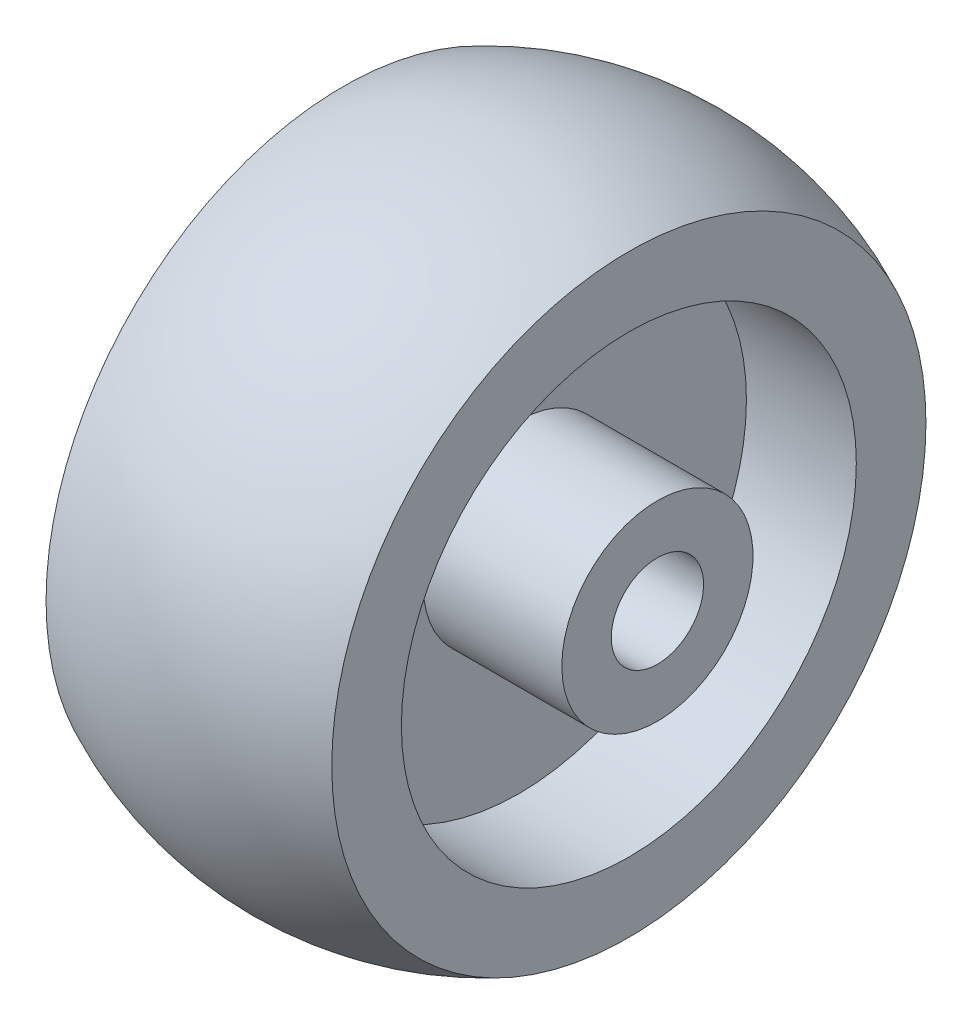
ISO-10303-21;
HEADER;
FILE_DESCRIPTION(('STEP AP214'),'2;1');
FILE_NAME('part.step','',(''),(''),'','','');
FILE_SCHEMA(('AUTOMOTIVE_DESIGN { 1 0 10303 214 1 1 1 1 }'));
ENDSEC;
DATA;
#1=APPLICATION_CONTEXT('core data for automotive mechanical design processes');
#2=APPLICATION_PROTOCOL_DEFINITION('international standard','automotive_design',2000,#1);
#3=PRODUCT_CONTEXT('',#1,'mechanical');
#4=PRODUCT('Part','Part','',(#3));
#5=PRODUCT_RELATED_PRODUCT_CATEGORY('part','',(#4));
#6=PRODUCT_DEFINITION_FORMATION('','',#4);
#7=PRODUCT_DEFINITION_CONTEXT('part definition',#1,'design');
#8=PRODUCT_DEFINITION('design','',#6,#7);
#9=PRODUCT_DEFINITION_SHAPE('','',#8);
#10=(LENGTH_UNIT() NAMED_UNIT(*) SI_UNIT(.MILLI.,.METRE.));
#11=(NAMED_UNIT(*) PLANE_ANGLE_UNIT() SI_UNIT($,.RADIAN.));
#12=(NAMED_UNIT(*) SI_UNIT($,.STERADIAN.) SOLID_ANGLE_UNIT());
#13=UNCERTAINTY_MEASURE_WITH_UNIT(LENGTH_MEASURE(1.E-05),#10,'distance_accuracy_value','');
#14=(GEOMETRIC_REPRESENTATION_CONTEXT(3) GLOBAL_UNCERTAINTY_ASSIGNED_CONTEXT((#13)) GLOBAL_UNIT_ASSIGNED_CONTEXT((#10,
#11,#12)) REPRESENTATION_CONTEXT('',''));
#15=CARTESIAN_POINT('',(0.,0.,0.));
#16=DIRECTION('',(0.,0.,1.));
#17=DIRECTION('',(1.,0.,0.));
#18=AXIS2_PLACEMENT_3D('',#15,#16,#17);
#19=CARTESIAN_POINT('',(6.5,0.,0.));
#20=DIRECTION('',(1.,0.,0.));
#21=DIRECTION('',(0.,1.,0.));
#22=AXIS2_PLACEMENT_3D('',#19,#20,#21);
#23=PLANE('',#22);
#24=CARTESIAN_POINT('',(6.5,0.,0.));
#25=DIRECTION('',(1.,0.,0.));
#26=DIRECTION('',(0.,0.,1.));
#27=AXIS2_PLACEMENT_3D('',#24,#25,#26);
#28=CIRCLE('',#27,10.35);
#29=CARTESIAN_POINT('',(6.5,0.,10.35));
#30=VERTEX_POINT('',#29);
#31=EDGE_CURVE('E61',#30,#30,#28,.T.);
#32=ORIENTED_EDGE('',*,*,#31,.F.);
#33=EDGE_LOOP('',(#32));
#34=FACE_BOUND('',#33,.T.);
#35=CARTESIAN_POINT('',(6.5,0.,0.));
#36=DIRECTION('',(1.,0.,0.));
#37=DIRECTION('',(0.,0.,1.));
#38=AXIS2_PLACEMENT_3D('',#35,#36,#37);
#39=CIRCLE('',#38,13.518505834596);
#40=CARTESIAN_POINT('',(6.5,0.,13.518505834596));
#41=VERTEX_POINT('',#40);
#42=EDGE_CURVE('E128',#41,#41,#39,.T.);
#43=ORIENTED_EDGE('',*,*,#42,.T.);
#44=EDGE_LOOP('',(#43));
#45=FACE_BOUND('',#44,.T.);
#46=ADVANCED_FACE('F51',(#34,#45),#23,.T.);
#47=CARTESIAN_POINT('',(6.5,0.,0.));
#48=DIRECTION('',(-1.,0.,0.));
#49=DIRECTION('',(0.,0.,1.));
#50=AXIS2_PLACEMENT_3D('',#47,#48,#49);
#51=CYLINDRICAL_SURFACE('',#50,10.35);
#52=ORIENTED_EDGE('',*,*,#31,.T.);
#53=DIRECTION('',(-1.,0.,0.));
#54=VECTOR('',#53,1.);
#55=CARTESIAN_POINT('',(6.5,0.,10.35));
#56=LINE('',#55,#54);
#57=CARTESIAN_POINT('',(1.5,0.,10.35));
#58=VERTEX_POINT('',#57);
#59=EDGE_CURVE('E11',#30,#58,#56,.T.);
#60=ORIENTED_EDGE('',*,*,#59,.T.);
#61=CARTESIAN_POINT('',(1.5,0.,0.));
#62=DIRECTION('',(1.,0.,0.));
#63=DIRECTION('',(0.,0.,1.));
#64=AXIS2_PLACEMENT_3D('',#61,#62,#63);
#65=CIRCLE('',#64,10.35);
#66=EDGE_CURVE('E157',#58,#58,#65,.T.);
#67=ORIENTED_EDGE('',*,*,#66,.F.);
#68=ORIENTED_EDGE('',*,*,#59,.F.);
#69=EDGE_LOOP('',(#52,#60,#67,#68));
#70=FACE_BOUND('',#69,.T.);
#71=ADVANCED_FACE('F53',(#70),#51,.F.);
#72=CARTESIAN_POINT('',(1.5,0.,0.));
#73=DIRECTION('',(1.,0.,0.));
#74=DIRECTION('',(0.,1.,0.));
#75=AXIS2_PLACEMENT_3D('',#72,#73,#74);
#76=PLANE('',#75);
#77=CARTESIAN_POINT('',(1.5,0.,0.));
#78=DIRECTION('',(1.,0.,0.));
#79=DIRECTION('',(0.,0.,1.));
#80=AXIS2_PLACEMENT_3D('',#77,#78,#79);
#81=CIRCLE('',#80,4.35);
#82=CARTESIAN_POINT('',(1.5,0.,4.35));
#83=VERTEX_POINT('',#82);
#84=EDGE_CURVE('E171',#83,#83,#81,.T.);
#85=ORIENTED_EDGE('',*,*,#84,.F.);
#86=EDGE_LOOP('',(#85));
#87=FACE_BOUND('',#86,.T.);
#88=ORIENTED_EDGE('',*,*,#66,.T.);
#89=EDGE_LOOP('',(#88));
#90=FACE_BOUND('',#89,.T.);
#91=ADVANCED_FACE('F185',(#87,#90),#76,.T.);
#92=CARTESIAN_POINT('',(1.5,0.,0.));
#93=DIRECTION('',(1.,0.,0.));
#94=DIRECTION('',(0.,0.,1.));
#95=AXIS2_PLACEMENT_3D('',#92,#93,#94);
#96=CYLINDRICAL_SURFACE('',#95,4.35);
#97=ORIENTED_EDGE('',*,*,#84,.T.);
#98=DIRECTION('',(1.,0.,0.));
#99=VECTOR('',#98,1.);
#100=CARTESIAN_POINT('',(1.5,0.,4.35));
#101=LINE('',#100,#99);
#102=CARTESIAN_POINT('',(7.8,0.,4.35));
#103=VERTEX_POINT('',#102);
#104=EDGE_CURVE('E83',#83,#103,#101,.T.);
#105=ORIENTED_EDGE('',*,*,#104,.T.);
#106=CARTESIAN_POINT('',(7.8,0.,0.));
#107=DIRECTION('',(1.,0.,0.));
#108=DIRECTION('',(0.,0.,1.));
#109=AXIS2_PLACEMENT_3D('',#106,#107,#108);
#110=CIRCLE('',#109,4.35);
#111=EDGE_CURVE('E168',#103,#103,#110,.T.);
#112=ORIENTED_EDGE('',*,*,#111,.F.);
#113=ORIENTED_EDGE('',*,*,#104,.F.);
#114=EDGE_LOOP('',(#97,#105,#112,#113));
#115=FACE_BOUND('',#114,.T.);
#116=ADVANCED_FACE('F210',(#115),#96,.T.);
#117=CARTESIAN_POINT('',(7.8,0.,0.));
#118=DIRECTION('',(1.,0.,0.));
#119=DIRECTION('',(0.,1.,0.));
#120=AXIS2_PLACEMENT_3D('',#117,#118,#119);
#121=PLANE('',#120);
#122=CARTESIAN_POINT('',(7.8,0.,0.));
#123=DIRECTION('',(1.,0.,0.));
#124=DIRECTION('',(0.,0.,1.));
#125=AXIS2_PLACEMENT_3D('',#122,#123,#124);
#126=CIRCLE('',#125,2.1);
#127=CARTESIAN_POINT('',(7.8,0.,2.1));
#128=VERTEX_POINT('',#127);
#129=EDGE_CURVE('E95',#128,#128,#126,.T.);
#130=ORIENTED_EDGE('',*,*,#129,.F.);
#131=EDGE_LOOP('',(#130));
#132=FACE_BOUND('',#131,.T.);
#133=ORIENTED_EDGE('',*,*,#111,.T.);
#134=EDGE_LOOP('',(#133));
#135=FACE_BOUND('',#134,.T.);
#136=ADVANCED_FACE('F213',(#132,#135),#121,.T.);
#137=CARTESIAN_POINT('',(-7.8,0.,0.));
#138=DIRECTION('',(1.,0.,0.));
#139=DIRECTION('',(0.,0.,1.));
#140=AXIS2_PLACEMENT_3D('',#137,#138,#139);
#141=CYLINDRICAL_SURFACE('',#140,2.1);
#142=DIRECTION('',(1.,0.,0.));
#143=VECTOR('',#142,1.);
#144=CARTESIAN_POINT('',(-7.8,0.,2.1));
#145=LINE('',#144,#143);
#146=CARTESIAN_POINT('',(-7.8,0.,2.1));
#147=VERTEX_POINT('',#146);
#148=EDGE_CURVE('E100',#147,#128,#145,.T.);
#149=ORIENTED_EDGE('',*,*,#148,.T.);
#150=ORIENTED_EDGE('',*,*,#129,.T.);
#151=ORIENTED_EDGE('',*,*,#148,.F.);
#152=CARTESIAN_POINT('',(-7.8,0.,0.));
#153=DIRECTION('',(1.,0.,0.));
#154=DIRECTION('',(0.,0.,1.));
#155=AXIS2_PLACEMENT_3D('',#152,#153,#154);
#156=CIRCLE('',#155,2.1);
#157=EDGE_CURVE('E163',#147,#147,#156,.T.);
#158=ORIENTED_EDGE('',*,*,#157,.F.);
#159=EDGE_LOOP('',(#149,#150,#151,#158));
#160=FACE_BOUND('',#159,.T.);
#161=ADVANCED_FACE('F208',(#160),#141,.F.);
#162=CARTESIAN_POINT('',(-7.8,0.,0.));
#163=DIRECTION('',(1.,0.,0.));
#164=DIRECTION('',(0.,1.,0.));
#165=AXIS2_PLACEMENT_3D('',#162,#163,#164);
#166=PLANE('',#165);
#167=CARTESIAN_POINT('',(-7.8,0.,0.));
#168=DIRECTION('',(1.,0.,0.));
#169=DIRECTION('',(0.,0.,1.));
#170=AXIS2_PLACEMENT_3D('',#167,#168,#169);
#171=CIRCLE('',#170,4.35);
#172=CARTESIAN_POINT('',(-7.8,0.,4.35));
#173=VERTEX_POINT('',#172);
#174=EDGE_CURVE('E148',#173,#173,#171,.T.);
#175=ORIENTED_EDGE('',*,*,#174,.F.);
#176=EDGE_LOOP('',(#175));
#177=FACE_BOUND('',#176,.T.);
#178=ORIENTED_EDGE('',*,*,#157,.T.);
#179=EDGE_LOOP('',(#178));
#180=FACE_BOUND('',#179,.T.);
#181=ADVANCED_FACE('F204',(#177,#180),#166,.F.);
#182=CARTESIAN_POINT('',(-7.8,0.,0.));
#183=DIRECTION('',(1.,0.,0.));
#184=DIRECTION('',(0.,0.,1.));
#185=AXIS2_PLACEMENT_3D('',#182,#183,#184);
#186=CYLINDRICAL_SURFACE('',#185,4.35);
#187=ORIENTED_EDGE('',*,*,#174,.T.);
#188=DIRECTION('',(1.,0.,0.));
#189=VECTOR('',#188,1.);
#190=CARTESIAN_POINT('',(-7.8,0.,4.35));
#191=LINE('',#190,#189);
#192=CARTESIAN_POINT('',(-1.5,0.,4.35));
#193=VERTEX_POINT('',#192);
#194=EDGE_CURVE('E152',#173,#193,#191,.T.);
#195=ORIENTED_EDGE('',*,*,#194,.T.);
#196=CARTESIAN_POINT('',(-1.5,0.,0.));
#197=DIRECTION('',(1.,0.,0.));
#198=DIRECTION('',(0.,0.,1.));
#199=AXIS2_PLACEMENT_3D('',#196,#197,#198);
#200=CIRCLE('',#199,4.35);
#201=EDGE_CURVE('E153',#193,#193,#200,.T.);
#202=ORIENTED_EDGE('',*,*,#201,.F.);
#203=ORIENTED_EDGE('',*,*,#194,.F.);
#204=EDGE_LOOP('',(#187,#195,#202,#203));
#205=FACE_BOUND('',#204,.T.);
#206=ADVANCED_FACE('F200',(#205),#186,.T.);
#207=CARTESIAN_POINT('',(-1.5,0.,0.));
#208=DIRECTION('',(1.,0.,0.));
#209=DIRECTION('',(0.,1.,0.));
#210=AXIS2_PLACEMENT_3D('',#207,#208,#209);
#211=PLANE('',#210);
#212=CARTESIAN_POINT('',(-1.5,0.,0.));
#213=DIRECTION('',(1.,0.,0.));
#214=DIRECTION('',(0.,0.,1.));
#215=AXIS2_PLACEMENT_3D('',#212,#213,#214);
#216=CIRCLE('',#215,10.35);
#217=CARTESIAN_POINT('',(-1.5,0.,10.35));
#218=VERTEX_POINT('',#217);
#219=EDGE_CURVE('E140',#218,#218,#216,.T.);
#220=ORIENTED_EDGE('',*,*,#219,.F.);
#221=EDGE_LOOP('',(#220));
#222=FACE_BOUND('',#221,.T.);
#223=ORIENTED_EDGE('',*,*,#201,.T.);
#224=EDGE_LOOP('',(#223));
#225=FACE_BOUND('',#224,.T.);
#226=ADVANCED_FACE('F193',(#222,#225),#211,.F.);
#227=CARTESIAN_POINT('',(-1.5,0.,0.));
#228=DIRECTION('',(-1.,0.,0.));
#229=DIRECTION('',(0.,0.,1.));
#230=AXIS2_PLACEMENT_3D('',#227,#228,#229);
#231=CYLINDRICAL_SURFACE('',#230,10.35);
#232=ORIENTED_EDGE('',*,*,#219,.T.);
#233=DIRECTION('',(-1.,0.,0.));
#234=VECTOR('',#233,1.);
#235=CARTESIAN_POINT('',(-1.5,0.,10.35));
#236=LINE('',#235,#234);
#237=CARTESIAN_POINT('',(-6.5,0.,10.35));
#238=VERTEX_POINT('',#237);
#239=EDGE_CURVE('E154',#218,#238,#236,.T.);
#240=ORIENTED_EDGE('',*,*,#239,.T.);
#241=CARTESIAN_POINT('',(-6.5,0.,0.));
#242=DIRECTION('',(1.,0.,0.));
#243=DIRECTION('',(0.,0.,1.));
#244=AXIS2_PLACEMENT_3D('',#241,#242,#243);
#245=CIRCLE('',#244,10.35);
#246=EDGE_CURVE('E133',#238,#238,#245,.T.);
#247=ORIENTED_EDGE('',*,*,#246,.F.);
#248=ORIENTED_EDGE('',*,*,#239,.F.);
#249=EDGE_LOOP('',(#232,#240,#247,#248));
#250=FACE_BOUND('',#249,.T.);
#251=ADVANCED_FACE('F189',(#250),#231,.F.);
#252=CARTESIAN_POINT('',(-6.5,0.,0.));
#253=DIRECTION('',(1.,0.,0.));
#254=DIRECTION('',(0.,1.,0.));
#255=AXIS2_PLACEMENT_3D('',#252,#253,#254);
#256=PLANE('',#255);
#257=CARTESIAN_POINT('',(-6.5,0.,0.));
#258=DIRECTION('',(1.,0.,0.));
#259=DIRECTION('',(0.,0.,1.));
#260=AXIS2_PLACEMENT_3D('',#257,#258,#259);
#261=CIRCLE('',#260,13.518505834596);
#262=CARTESIAN_POINT('',(-6.5,0.,13.518505834596));
#263=VERTEX_POINT('',#262);
#264=EDGE_CURVE('E134',#263,#263,#261,.T.);
#265=ORIENTED_EDGE('',*,*,#264,.F.);
#266=EDGE_LOOP('',(#265));
#267=FACE_BOUND('',#266,.T.);
#268=ORIENTED_EDGE('',*,*,#246,.T.);
#269=EDGE_LOOP('',(#268));
#270=FACE_BOUND('',#269,.T.);
#271=ADVANCED_FACE('F192',(#267,#270),#256,.F.);
#272=CARTESIAN_POINT('',(0.,0.,0.));
#273=DIRECTION('',(-1.,0.,0.));
#274=DIRECTION('',(0.,0.,1.));
#275=AXIS2_PLACEMENT_3D('',#272,#273,#274);
#276=SPHERICAL_SURFACE('',#275,15.);
#277=CARTESIAN_POINT('',(0.,0.,0.));
#278=DIRECTION('',(0.,-1.,0.));
#279=DIRECTION('',(1.,0.,0.));
#280=AXIS2_PLACEMENT_3D('',#277,#278,#279);
#281=CIRCLE('',#280,15.);
#282=EDGE_CURVE('E143',#41,#263,#281,.T.);
#283=ORIENTED_EDGE('',*,*,#282,.T.);
#284=ORIENTED_EDGE('',*,*,#264,.T.);
#285=ORIENTED_EDGE('',*,*,#282,.F.);
#286=ORIENTED_EDGE('',*,*,#42,.F.);
#287=EDGE_LOOP('',(#283,#284,#285,#286));
#288=FACE_BOUND('',#287,.T.);
#289=ADVANCED_FACE('F188',(#288),#276,.T.);
#290=CLOSED_SHELL('',(#46,#71,#91,#116,#136,#161,#181,#206,#226,#251,#271,#289));
#291=MANIFOLD_SOLID_BREP('B2',#290);
#292=ADVANCED_BREP_SHAPE_REPRESENTATION('',(#18,#291),#14);
#293=SHAPE_DEFINITION_REPRESENTATION(#9,#292);
ENDSEC;
END-ISO-10303-21;
